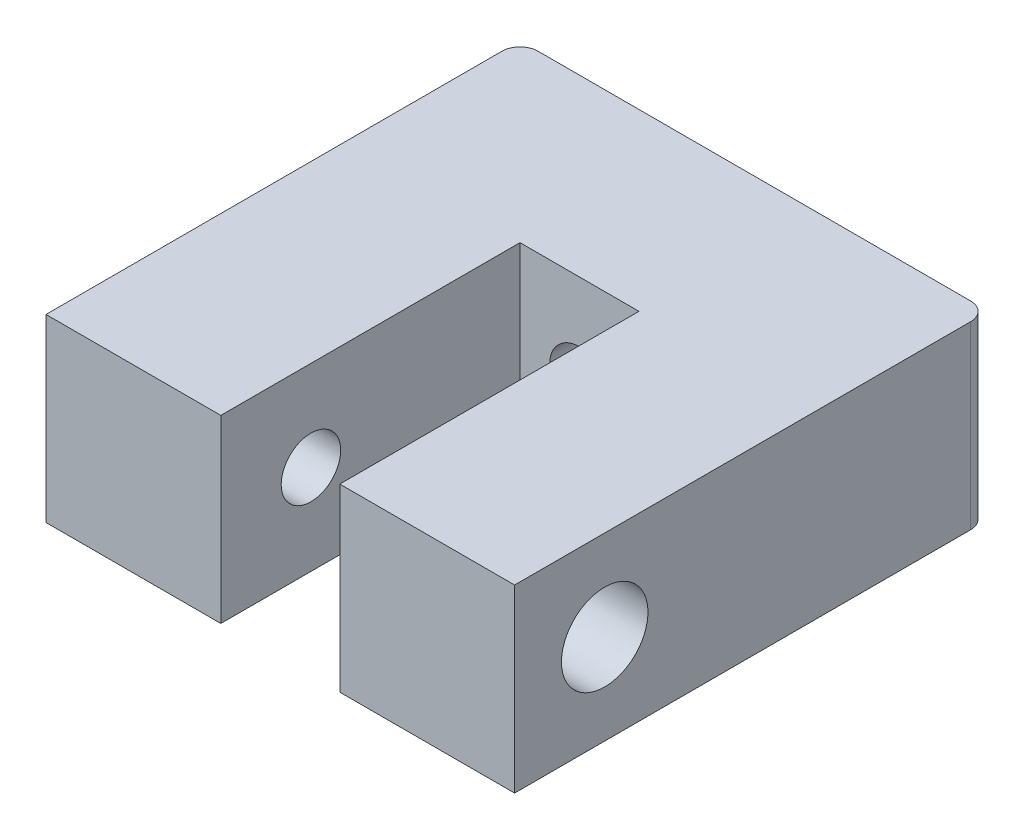
ISO-10303-21;
HEADER;
FILE_DESCRIPTION(('STEP AP214'),'2;1');
FILE_NAME('part.step','',(''),(''),'','','');
FILE_SCHEMA(('AUTOMOTIVE_DESIGN { 1 0 10303 214 1 1 1 1 }'));
ENDSEC;
DATA;
#1=APPLICATION_CONTEXT('core data for automotive mechanical design processes');
#2=APPLICATION_PROTOCOL_DEFINITION('international standard','automotive_design',2000,#1);
#3=PRODUCT_CONTEXT('',#1,'mechanical');
#4=PRODUCT('Part','Part','',(#3));
#5=PRODUCT_RELATED_PRODUCT_CATEGORY('part','',(#4));
#6=PRODUCT_DEFINITION_FORMATION('','',#4);
#7=PRODUCT_DEFINITION_CONTEXT('part definition',#1,'design');
#8=PRODUCT_DEFINITION('design','',#6,#7);
#9=PRODUCT_DEFINITION_SHAPE('','',#8);
#10=(LENGTH_UNIT() NAMED_UNIT(*) SI_UNIT(.MILLI.,.METRE.));
#11=(NAMED_UNIT(*) PLANE_ANGLE_UNIT() SI_UNIT($,.RADIAN.));
#12=(NAMED_UNIT(*) SI_UNIT($,.STERADIAN.) SOLID_ANGLE_UNIT());
#13=UNCERTAINTY_MEASURE_WITH_UNIT(LENGTH_MEASURE(1.E-05),#10,'distance_accuracy_value','');
#14=(GEOMETRIC_REPRESENTATION_CONTEXT(3) GLOBAL_UNCERTAINTY_ASSIGNED_CONTEXT((#13)) GLOBAL_UNIT_ASSIGNED_CONTEXT((#10,
#11,#12)) REPRESENTATION_CONTEXT('',''));
#15=CARTESIAN_POINT('',(0.,0.,0.));
#16=DIRECTION('',(0.,0.,1.));
#17=DIRECTION('',(1.,0.,0.));
#18=AXIS2_PLACEMENT_3D('',#15,#16,#17);
#19=CARTESIAN_POINT('',(13.,10.,13.3));
#20=DIRECTION('',(-1.,0.,0.));
#21=DIRECTION('',(0.,0.,1.));
#22=AXIS2_PLACEMENT_3D('',#19,#20,#21);
#23=PLANE('',#22);
#24=CARTESIAN_POINT('',(13.,5.,8.3));
#25=DIRECTION('',(-1.,0.,0.));
#26=DIRECTION('',(0.,0.,1.));
#27=AXIS2_PLACEMENT_3D('',#24,#25,#26);
#28=CIRCLE('',#27,2.4);
#29=CARTESIAN_POINT('',(13.,5.,10.7));
#30=VERTEX_POINT('',#29);
#31=EDGE_CURVE('E314',#30,#30,#28,.T.);
#32=ORIENTED_EDGE('',*,*,#31,.T.);
#33=EDGE_LOOP('',(#32));
#34=FACE_BOUND('',#33,.T.);
#35=DIRECTION('',(0.,0.,-1.));
#36=VECTOR('',#35,1.);
#37=CARTESIAN_POINT('',(13.,0.,13.3));
#38=LINE('',#37,#36);
#39=CARTESIAN_POINT('',(13.,0.,13.3));
#40=VERTEX_POINT('',#39);
#41=CARTESIAN_POINT('',(13.,0.,-11.9999999999999));
#42=VERTEX_POINT('',#41);
#43=EDGE_CURVE('E160',#40,#42,#38,.T.);
#44=ORIENTED_EDGE('',*,*,#43,.T.);
#45=DIRECTION('',(0.,-1.,0.));
#46=VECTOR('',#45,1.);
#47=CARTESIAN_POINT('',(13.,10.,-11.9999999999999));
#48=LINE('',#47,#46);
#49=CARTESIAN_POINT('',(13.,10.,-11.9999999999999));
#50=VERTEX_POINT('',#49);
#51=EDGE_CURVE('E63',#42,#50,#48,.F.);
#52=ORIENTED_EDGE('',*,*,#51,.T.);
#53=DIRECTION('',(0.,0.,-1.));
#54=VECTOR('',#53,1.);
#55=CARTESIAN_POINT('',(13.,10.,13.3));
#56=LINE('',#55,#54);
#57=CARTESIAN_POINT('',(13.,10.,13.3));
#58=VERTEX_POINT('',#57);
#59=EDGE_CURVE('E186',#58,#50,#56,.T.);
#60=ORIENTED_EDGE('',*,*,#59,.F.);
#61=DIRECTION('',(0.,-1.,0.));
#62=VECTOR('',#61,1.);
#63=CARTESIAN_POINT('',(13.,10.,13.3));
#64=LINE('',#63,#62);
#65=EDGE_CURVE('E159',#58,#40,#64,.T.);
#66=ORIENTED_EDGE('',*,*,#65,.T.);
#67=EDGE_LOOP('',(#44,#52,#60,#66));
#68=FACE_BOUND('',#67,.T.);
#69=ADVANCED_FACE('F39',(#34,#68),#23,.F.);
#70=CARTESIAN_POINT('',(13.,10.,-12.9999999999999));
#71=DIRECTION('',(0.,0.,1.));
#72=DIRECTION('',(1.,0.,0.));
#73=AXIS2_PLACEMENT_3D('',#70,#71,#72);
#74=PLANE('',#73);
#75=CARTESIAN_POINT('',(0.,5.,-12.9999999999999));
#76=DIRECTION('',(0.,0.,-1.));
#77=DIRECTION('',(-1.,0.,0.));
#78=AXIS2_PLACEMENT_3D('',#75,#76,#77);
#79=CIRCLE('',#78,1.65);
#80=CARTESIAN_POINT('',(-1.65,5.,-12.9999999999999));
#81=VERTEX_POINT('',#80);
#82=EDGE_CURVE('E304',#81,#81,#79,.T.);
#83=ORIENTED_EDGE('',*,*,#82,.F.);
#84=EDGE_LOOP('',(#83));
#85=FACE_BOUND('',#84,.T.);
#86=DIRECTION('',(-1.,0.,0.));
#87=VECTOR('',#86,1.);
#88=CARTESIAN_POINT('',(13.,10.,-12.9999999999999));
#89=LINE('',#88,#87);
#90=CARTESIAN_POINT('',(12.,10.,-12.9999999999999));
#91=VERTEX_POINT('',#90);
#92=CARTESIAN_POINT('',(-12.,10.,-12.9999999999999));
#93=VERTEX_POINT('',#92);
#94=EDGE_CURVE('E127',#91,#93,#89,.T.);
#95=ORIENTED_EDGE('',*,*,#94,.F.);
#96=DIRECTION('',(0.,-1.,0.));
#97=VECTOR('',#96,1.);
#98=CARTESIAN_POINT('',(12.,10.,-12.9999999999999));
#99=LINE('',#98,#97);
#100=CARTESIAN_POINT('',(12.,0.,-12.9999999999999));
#101=VERTEX_POINT('',#100);
#102=EDGE_CURVE('E205',#91,#101,#99,.T.);
#103=ORIENTED_EDGE('',*,*,#102,.T.);
#104=DIRECTION('',(-1.,0.,0.));
#105=VECTOR('',#104,1.);
#106=CARTESIAN_POINT('',(13.,0.,-12.9999999999999));
#107=LINE('',#106,#105);
#108=CARTESIAN_POINT('',(-12.,0.,-12.9999999999999));
#109=VERTEX_POINT('',#108);
#110=EDGE_CURVE('E163',#101,#109,#107,.T.);
#111=ORIENTED_EDGE('',*,*,#110,.T.);
#112=DIRECTION('',(0.,-1.,0.));
#113=VECTOR('',#112,1.);
#114=CARTESIAN_POINT('',(-12.,10.,-12.9999999999999));
#115=LINE('',#114,#113);
#116=EDGE_CURVE('E138',#109,#93,#115,.F.);
#117=ORIENTED_EDGE('',*,*,#116,.T.);
#118=EDGE_LOOP('',(#95,#103,#111,#117));
#119=FACE_BOUND('',#118,.T.);
#120=ADVANCED_FACE('F224',(#85,#119),#74,.F.);
#121=CARTESIAN_POINT('',(-13.,10.,-12.9999999999999));
#122=DIRECTION('',(1.,0.,0.));
#123=DIRECTION('',(0.,0.,-1.));
#124=AXIS2_PLACEMENT_3D('',#121,#122,#123);
#125=PLANE('',#124);
#126=CARTESIAN_POINT('',(-13.,5.,8.3));
#127=DIRECTION('',(-1.,0.,0.));
#128=DIRECTION('',(0.,0.,1.));
#129=AXIS2_PLACEMENT_3D('',#126,#127,#128);
#130=CIRCLE('',#129,1.65);
#131=CARTESIAN_POINT('',(-13.,5.,9.95));
#132=VERTEX_POINT('',#131);
#133=EDGE_CURVE('E317',#132,#132,#130,.T.);
#134=ORIENTED_EDGE('',*,*,#133,.F.);
#135=EDGE_LOOP('',(#134));
#136=FACE_BOUND('',#135,.T.);
#137=DIRECTION('',(0.,0.,1.));
#138=VECTOR('',#137,1.);
#139=CARTESIAN_POINT('',(-13.,10.,-12.9999999999999));
#140=LINE('',#139,#138);
#141=CARTESIAN_POINT('',(-13.,10.,-11.9999999999999));
#142=VERTEX_POINT('',#141);
#143=CARTESIAN_POINT('',(-13.,10.,13.3));
#144=VERTEX_POINT('',#143);
#145=EDGE_CURVE('E117',#142,#144,#140,.T.);
#146=ORIENTED_EDGE('',*,*,#145,.F.);
#147=DIRECTION('',(0.,-1.,0.));
#148=VECTOR('',#147,1.);
#149=CARTESIAN_POINT('',(-13.,10.,-11.9999999999999));
#150=LINE('',#149,#148);
#151=CARTESIAN_POINT('',(-13.,0.,-11.9999999999999));
#152=VERTEX_POINT('',#151);
#153=EDGE_CURVE('E11',#142,#152,#150,.T.);
#154=ORIENTED_EDGE('',*,*,#153,.T.);
#155=DIRECTION('',(0.,0.,1.));
#156=VECTOR('',#155,1.);
#157=CARTESIAN_POINT('',(-13.,0.,-12.9999999999999));
#158=LINE('',#157,#156);
#159=CARTESIAN_POINT('',(-13.,0.,13.3));
#160=VERTEX_POINT('',#159);
#161=EDGE_CURVE('E133',#152,#160,#158,.T.);
#162=ORIENTED_EDGE('',*,*,#161,.T.);
#163=DIRECTION('',(0.,-1.,0.));
#164=VECTOR('',#163,1.);
#165=CARTESIAN_POINT('',(-13.,10.,13.3));
#166=LINE('',#165,#164);
#167=EDGE_CURVE('E130',#144,#160,#166,.T.);
#168=ORIENTED_EDGE('',*,*,#167,.F.);
#169=EDGE_LOOP('',(#146,#154,#162,#168));
#170=FACE_BOUND('',#169,.T.);
#171=ADVANCED_FACE('F131',(#136,#170),#125,.F.);
#172=CARTESIAN_POINT('',(-13.,10.,13.3));
#173=DIRECTION('',(0.,0.,-1.));
#174=DIRECTION('',(-1.,0.,0.));
#175=AXIS2_PLACEMENT_3D('',#172,#173,#174);
#176=PLANE('',#175);
#177=DIRECTION('',(1.,0.,0.));
#178=VECTOR('',#177,1.);
#179=CARTESIAN_POINT('',(-13.,0.,13.3));
#180=LINE('',#179,#178);
#181=CARTESIAN_POINT('',(-3.3,0.,13.3));
#182=VERTEX_POINT('',#181);
#183=EDGE_CURVE('E170',#160,#182,#180,.T.);
#184=ORIENTED_EDGE('',*,*,#183,.T.);
#185=DIRECTION('',(0.,-1.,0.));
#186=VECTOR('',#185,1.);
#187=CARTESIAN_POINT('',(-3.3,10.,13.3));
#188=LINE('',#187,#186);
#189=CARTESIAN_POINT('',(-3.3,10.,13.3));
#190=VERTEX_POINT('',#189);
#191=EDGE_CURVE('E139',#190,#182,#188,.T.);
#192=ORIENTED_EDGE('',*,*,#191,.F.);
#193=DIRECTION('',(1.,0.,0.));
#194=VECTOR('',#193,1.);
#195=CARTESIAN_POINT('',(-13.,10.,13.3));
#196=LINE('',#195,#194);
#197=EDGE_CURVE('E122',#144,#190,#196,.T.);
#198=ORIENTED_EDGE('',*,*,#197,.F.);
#199=ORIENTED_EDGE('',*,*,#167,.T.);
#200=EDGE_LOOP('',(#184,#192,#198,#199));
#201=FACE_BOUND('',#200,.T.);
#202=ADVANCED_FACE('F141',(#201),#176,.F.);
#203=CARTESIAN_POINT('',(-3.3,10.,-3.3));
#204=DIRECTION('',(1.,0.,0.));
#205=DIRECTION('',(0.,0.,-1.));
#206=AXIS2_PLACEMENT_3D('',#203,#204,#205);
#207=PLANE('',#206);
#208=CARTESIAN_POINT('',(-3.3,5.,8.3));
#209=DIRECTION('',(1.,0.,0.));
#210=DIRECTION('',(0.,0.,-1.));
#211=AXIS2_PLACEMENT_3D('',#208,#209,#210);
#212=CIRCLE('',#211,1.65);
#213=CARTESIAN_POINT('',(-3.3,5.,6.65));
#214=VERTEX_POINT('',#213);
#215=EDGE_CURVE('E164',#214,#214,#212,.T.);
#216=ORIENTED_EDGE('',*,*,#215,.F.);
#217=EDGE_LOOP('',(#216));
#218=FACE_BOUND('',#217,.T.);
#219=DIRECTION('',(0.,0.,1.));
#220=VECTOR('',#219,1.);
#221=CARTESIAN_POINT('',(-3.3,0.,-3.3));
#222=LINE('',#221,#220);
#223=CARTESIAN_POINT('',(-3.3,0.,-3.3));
#224=VERTEX_POINT('',#223);
#225=EDGE_CURVE('E173',#224,#182,#222,.T.);
#226=ORIENTED_EDGE('',*,*,#225,.F.);
#227=DIRECTION('',(0.,-1.,0.));
#228=VECTOR('',#227,1.);
#229=CARTESIAN_POINT('',(-3.3,10.,-3.3));
#230=LINE('',#229,#228);
#231=CARTESIAN_POINT('',(-3.3,10.,-3.3));
#232=VERTEX_POINT('',#231);
#233=EDGE_CURVE('E198',#232,#224,#230,.T.);
#234=ORIENTED_EDGE('',*,*,#233,.F.);
#235=DIRECTION('',(0.,0.,1.));
#236=VECTOR('',#235,1.);
#237=CARTESIAN_POINT('',(-3.3,10.,-3.3));
#238=LINE('',#237,#236);
#239=EDGE_CURVE('E144',#232,#190,#238,.T.);
#240=ORIENTED_EDGE('',*,*,#239,.T.);
#241=ORIENTED_EDGE('',*,*,#191,.T.);
#242=EDGE_LOOP('',(#226,#234,#240,#241));
#243=FACE_BOUND('',#242,.T.);
#244=ADVANCED_FACE('F249',(#218,#243),#207,.T.);
#245=CARTESIAN_POINT('',(-3.3,10.,-3.3));
#246=DIRECTION('',(0.,0.,-1.));
#247=DIRECTION('',(-1.,0.,0.));
#248=AXIS2_PLACEMENT_3D('',#245,#246,#247);
#249=PLANE('',#248);
#250=CARTESIAN_POINT('',(0.,5.,-3.3));
#251=DIRECTION('',(0.,0.,-1.));
#252=DIRECTION('',(-1.,0.,0.));
#253=AXIS2_PLACEMENT_3D('',#250,#251,#252);
#254=CIRCLE('',#253,1.65);
#255=CARTESIAN_POINT('',(-1.65,5.,-3.3));
#256=VERTEX_POINT('',#255);
#257=EDGE_CURVE('E301',#256,#256,#254,.T.);
#258=ORIENTED_EDGE('',*,*,#257,.T.);
#259=EDGE_LOOP('',(#258));
#260=FACE_BOUND('',#259,.T.);
#261=DIRECTION('',(1.,0.,0.));
#262=VECTOR('',#261,1.);
#263=CARTESIAN_POINT('',(-3.3,0.,-3.3));
#264=LINE('',#263,#262);
#265=CARTESIAN_POINT('',(3.3,0.,-3.3));
#266=VERTEX_POINT('',#265);
#267=EDGE_CURVE('E177',#224,#266,#264,.T.);
#268=ORIENTED_EDGE('',*,*,#267,.T.);
#269=DIRECTION('',(0.,-1.,0.));
#270=VECTOR('',#269,1.);
#271=CARTESIAN_POINT('',(3.3,10.,-3.3));
#272=LINE('',#271,#270);
#273=CARTESIAN_POINT('',(3.3,10.,-3.3));
#274=VERTEX_POINT('',#273);
#275=EDGE_CURVE('E194',#274,#266,#272,.T.);
#276=ORIENTED_EDGE('',*,*,#275,.F.);
#277=DIRECTION('',(1.,0.,0.));
#278=VECTOR('',#277,1.);
#279=CARTESIAN_POINT('',(-3.3,10.,-3.3));
#280=LINE('',#279,#278);
#281=EDGE_CURVE('E147',#232,#274,#280,.T.);
#282=ORIENTED_EDGE('',*,*,#281,.F.);
#283=ORIENTED_EDGE('',*,*,#233,.T.);
#284=EDGE_LOOP('',(#268,#276,#282,#283));
#285=FACE_BOUND('',#284,.T.);
#286=ADVANCED_FACE('F247',(#260,#285),#249,.F.);
#287=CARTESIAN_POINT('',(3.3,10.,-3.3));
#288=DIRECTION('',(1.,0.,0.));
#289=DIRECTION('',(0.,0.,-1.));
#290=AXIS2_PLACEMENT_3D('',#287,#288,#289);
#291=PLANE('',#290);
#292=CARTESIAN_POINT('',(3.3,5.,8.3));
#293=DIRECTION('',(-1.,0.,0.));
#294=DIRECTION('',(0.,0.,1.));
#295=AXIS2_PLACEMENT_3D('',#292,#293,#294);
#296=CIRCLE('',#295,2.4);
#297=CARTESIAN_POINT('',(3.3,5.,10.7));
#298=VERTEX_POINT('',#297);
#299=EDGE_CURVE('E308',#298,#298,#296,.T.);
#300=ORIENTED_EDGE('',*,*,#299,.F.);
#301=EDGE_LOOP('',(#300));
#302=FACE_BOUND('',#301,.T.);
#303=DIRECTION('',(0.,0.,1.));
#304=VECTOR('',#303,1.);
#305=CARTESIAN_POINT('',(3.3,0.,-3.3));
#306=LINE('',#305,#304);
#307=CARTESIAN_POINT('',(3.3,0.,13.3));
#308=VERTEX_POINT('',#307);
#309=EDGE_CURVE('E180',#266,#308,#306,.T.);
#310=ORIENTED_EDGE('',*,*,#309,.T.);
#311=DIRECTION('',(0.,-1.,0.));
#312=VECTOR('',#311,1.);
#313=CARTESIAN_POINT('',(3.3,10.,13.3));
#314=LINE('',#313,#312);
#315=CARTESIAN_POINT('',(3.3,10.,13.3));
#316=VERTEX_POINT('',#315);
#317=EDGE_CURVE('E190',#316,#308,#314,.T.);
#318=ORIENTED_EDGE('',*,*,#317,.F.);
#319=DIRECTION('',(0.,0.,1.));
#320=VECTOR('',#319,1.);
#321=CARTESIAN_POINT('',(3.3,10.,-3.3));
#322=LINE('',#321,#320);
#323=EDGE_CURVE('E153',#274,#316,#322,.T.);
#324=ORIENTED_EDGE('',*,*,#323,.F.);
#325=ORIENTED_EDGE('',*,*,#275,.T.);
#326=EDGE_LOOP('',(#310,#318,#324,#325));
#327=FACE_BOUND('',#326,.T.);
#328=ADVANCED_FACE('F242',(#302,#327),#291,.F.);
#329=CARTESIAN_POINT('',(3.3,10.,13.3));
#330=DIRECTION('',(0.,0.,-1.));
#331=DIRECTION('',(-1.,0.,0.));
#332=AXIS2_PLACEMENT_3D('',#329,#330,#331);
#333=PLANE('',#332);
#334=DIRECTION('',(1.,0.,0.));
#335=VECTOR('',#334,1.);
#336=CARTESIAN_POINT('',(3.3,0.,13.3));
#337=LINE('',#336,#335);
#338=EDGE_CURVE('E183',#308,#40,#337,.T.);
#339=ORIENTED_EDGE('',*,*,#338,.T.);
#340=ORIENTED_EDGE('',*,*,#65,.F.);
#341=DIRECTION('',(1.,0.,0.));
#342=VECTOR('',#341,1.);
#343=CARTESIAN_POINT('',(3.3,10.,13.3));
#344=LINE('',#343,#342);
#345=EDGE_CURVE('E156',#316,#58,#344,.T.);
#346=ORIENTED_EDGE('',*,*,#345,.F.);
#347=ORIENTED_EDGE('',*,*,#317,.T.);
#348=EDGE_LOOP('',(#339,#340,#346,#347));
#349=FACE_BOUND('',#348,.T.);
#350=ADVANCED_FACE('F236',(#349),#333,.F.);
#351=CARTESIAN_POINT('',(0.,10.,0.));
#352=DIRECTION('',(0.,1.,0.));
#353=DIRECTION('',(0.,0.,1.));
#354=AXIS2_PLACEMENT_3D('',#351,#352,#353);
#355=PLANE('',#354);
#356=ORIENTED_EDGE('',*,*,#59,.T.);
#357=CARTESIAN_POINT('',(12.,10.,-11.9999999999999));
#358=DIRECTION('',(0.,1.,0.));
#359=DIRECTION('',(0.,0.,1.));
#360=AXIS2_PLACEMENT_3D('',#357,#358,#359);
#361=CIRCLE('',#360,1.);
#362=EDGE_CURVE('E48',#50,#91,#361,.T.);
#363=ORIENTED_EDGE('',*,*,#362,.T.);
#364=ORIENTED_EDGE('',*,*,#94,.T.);
#365=CARTESIAN_POINT('',(-12.,10.,-11.9999999999999));
#366=DIRECTION('',(0.,1.,0.));
#367=DIRECTION('',(0.,0.,1.));
#368=AXIS2_PLACEMENT_3D('',#365,#366,#367);
#369=CIRCLE('',#368,1.);
#370=EDGE_CURVE('E55',#93,#142,#369,.T.);
#371=ORIENTED_EDGE('',*,*,#370,.T.);
#372=ORIENTED_EDGE('',*,*,#145,.T.);
#373=ORIENTED_EDGE('',*,*,#197,.T.);
#374=ORIENTED_EDGE('',*,*,#239,.F.);
#375=ORIENTED_EDGE('',*,*,#281,.T.);
#376=ORIENTED_EDGE('',*,*,#323,.T.);
#377=ORIENTED_EDGE('',*,*,#345,.T.);
#378=EDGE_LOOP('',(#356,#363,#364,#371,#372,#373,#374,#375,#376,#377));
#379=FACE_BOUND('',#378,.T.);
#380=ADVANCED_FACE('F119',(#379),#355,.T.);
#381=CARTESIAN_POINT('',(0.,0.,0.));
#382=DIRECTION('',(0.,1.,0.));
#383=DIRECTION('',(0.,0.,1.));
#384=AXIS2_PLACEMENT_3D('',#381,#382,#383);
#385=PLANE('',#384);
#386=ORIENTED_EDGE('',*,*,#110,.F.);
#387=CARTESIAN_POINT('',(12.,0.,-11.9999999999999));
#388=DIRECTION('',(0.,1.,0.));
#389=DIRECTION('',(0.,0.,1.));
#390=AXIS2_PLACEMENT_3D('',#387,#388,#389);
#391=CIRCLE('',#390,1.);
#392=EDGE_CURVE('E212',#101,#42,#391,.F.);
#393=ORIENTED_EDGE('',*,*,#392,.T.);
#394=ORIENTED_EDGE('',*,*,#43,.F.);
#395=ORIENTED_EDGE('',*,*,#338,.F.);
#396=ORIENTED_EDGE('',*,*,#309,.F.);
#397=ORIENTED_EDGE('',*,*,#267,.F.);
#398=ORIENTED_EDGE('',*,*,#225,.T.);
#399=ORIENTED_EDGE('',*,*,#183,.F.);
#400=ORIENTED_EDGE('',*,*,#161,.F.);
#401=CARTESIAN_POINT('',(-12.,0.,-11.9999999999999));
#402=DIRECTION('',(0.,1.,0.));
#403=DIRECTION('',(0.,0.,1.));
#404=AXIS2_PLACEMENT_3D('',#401,#402,#403);
#405=CIRCLE('',#404,1.);
#406=EDGE_CURVE('E209',#152,#109,#405,.F.);
#407=ORIENTED_EDGE('',*,*,#406,.T.);
#408=EDGE_LOOP('',(#386,#393,#394,#395,#396,#397,#398,#399,#400,#407));
#409=FACE_BOUND('',#408,.T.);
#410=ADVANCED_FACE('F231',(#409),#385,.F.);
#411=CARTESIAN_POINT('',(-13.,5.,8.3));
#412=DIRECTION('',(-1.,0.,0.));
#413=DIRECTION('',(0.,0.,1.));
#414=AXIS2_PLACEMENT_3D('',#411,#412,#413);
#415=CYLINDRICAL_SURFACE('',#414,1.65);
#416=ORIENTED_EDGE('',*,*,#133,.T.);
#417=EDGE_LOOP('',(#416));
#418=FACE_BOUND('',#417,.T.);
#419=ORIENTED_EDGE('',*,*,#215,.T.);
#420=EDGE_LOOP('',(#419));
#421=FACE_BOUND('',#420,.T.);
#422=ADVANCED_FACE('F284',(#418,#421),#415,.F.);
#423=CARTESIAN_POINT('',(3.3,5.,8.3));
#424=DIRECTION('',(-1.,0.,0.));
#425=DIRECTION('',(0.,0.,1.));
#426=AXIS2_PLACEMENT_3D('',#423,#424,#425);
#427=CYLINDRICAL_SURFACE('',#426,2.4);
#428=ORIENTED_EDGE('',*,*,#31,.F.);
#429=EDGE_LOOP('',(#428));
#430=FACE_BOUND('',#429,.T.);
#431=ORIENTED_EDGE('',*,*,#299,.T.);
#432=EDGE_LOOP('',(#431));
#433=FACE_BOUND('',#432,.T.);
#434=ADVANCED_FACE('F289',(#430,#433),#427,.F.);
#435=CARTESIAN_POINT('',(0.,5.,-12.9999999999999));
#436=DIRECTION('',(0.,0.,-1.));
#437=DIRECTION('',(-1.,0.,0.));
#438=AXIS2_PLACEMENT_3D('',#435,#436,#437);
#439=CYLINDRICAL_SURFACE('',#438,1.65);
#440=ORIENTED_EDGE('',*,*,#257,.F.);
#441=EDGE_LOOP('',(#440));
#442=FACE_BOUND('',#441,.T.);
#443=ORIENTED_EDGE('',*,*,#82,.T.);
#444=EDGE_LOOP('',(#443));
#445=FACE_BOUND('',#444,.T.);
#446=ADVANCED_FACE('F255',(#442,#445),#439,.F.);
#447=CARTESIAN_POINT('',(12.,10.,-11.9999999999999));
#448=DIRECTION('',(0.,-1.,0.));
#449=DIRECTION('',(0.,0.,-1.));
#450=AXIS2_PLACEMENT_3D('',#447,#448,#449);
#451=CYLINDRICAL_SURFACE('',#450,1.);
#452=ORIENTED_EDGE('',*,*,#362,.F.);
#453=ORIENTED_EDGE('',*,*,#51,.F.);
#454=ORIENTED_EDGE('',*,*,#392,.F.);
#455=ORIENTED_EDGE('',*,*,#102,.F.);
#456=EDGE_LOOP('',(#452,#453,#454,#455));
#457=FACE_BOUND('',#456,.T.);
#458=ADVANCED_FACE('F228',(#457),#451,.T.);
#459=CARTESIAN_POINT('',(-12.,10.,-11.9999999999999));
#460=DIRECTION('',(0.,-1.,0.));
#461=DIRECTION('',(0.,0.,-1.));
#462=AXIS2_PLACEMENT_3D('',#459,#460,#461);
#463=CYLINDRICAL_SURFACE('',#462,1.);
#464=ORIENTED_EDGE('',*,*,#370,.F.);
#465=ORIENTED_EDGE('',*,*,#116,.F.);
#466=ORIENTED_EDGE('',*,*,#406,.F.);
#467=ORIENTED_EDGE('',*,*,#153,.F.);
#468=EDGE_LOOP('',(#464,#465,#466,#467));
#469=FACE_BOUND('',#468,.T.);
#470=ADVANCED_FACE('F41',(#469),#463,.T.);
#471=CLOSED_SHELL('',(#69,#120,#171,#202,#244,#286,#328,#350,#380,#410,#422,#434,#446,#458,#470));
#472=MANIFOLD_SOLID_BREP('B2',#471);
#473=ADVANCED_BREP_SHAPE_REPRESENTATION('',(#18,#472),#14);
#474=SHAPE_DEFINITION_REPRESENTATION(#9,#473);
ENDSEC;
END-ISO-10303-21;
